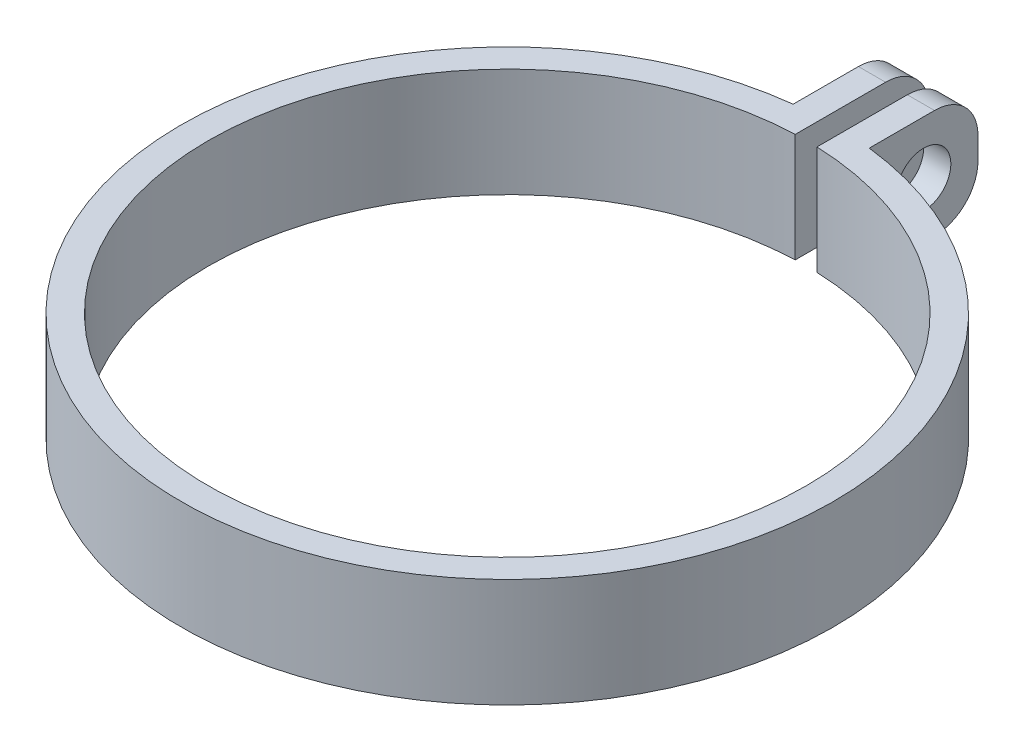
ISO-10303-21;
HEADER;
FILE_DESCRIPTION(('STEP AP214'),'2;1');
FILE_NAME('part.step','',(''),(''),'','','');
FILE_SCHEMA(('AUTOMOTIVE_DESIGN { 1 0 10303 214 1 1 1 1 }'));
ENDSEC;
DATA;
#1=APPLICATION_CONTEXT('core data for automotive mechanical design processes');
#2=APPLICATION_PROTOCOL_DEFINITION('international standard','automotive_design',2000,#1);
#3=PRODUCT_CONTEXT('',#1,'mechanical');
#4=PRODUCT('Part','Part','',(#3));
#5=PRODUCT_RELATED_PRODUCT_CATEGORY('part','',(#4));
#6=PRODUCT_DEFINITION_FORMATION('','',#4);
#7=PRODUCT_DEFINITION_CONTEXT('part definition',#1,'design');
#8=PRODUCT_DEFINITION('design','',#6,#7);
#9=PRODUCT_DEFINITION_SHAPE('','',#8);
#10=(LENGTH_UNIT() NAMED_UNIT(*) SI_UNIT(.MILLI.,.METRE.));
#11=(NAMED_UNIT(*) PLANE_ANGLE_UNIT() SI_UNIT($,.RADIAN.));
#12=(NAMED_UNIT(*) SI_UNIT($,.STERADIAN.) SOLID_ANGLE_UNIT());
#13=UNCERTAINTY_MEASURE_WITH_UNIT(LENGTH_MEASURE(1.E-05),#10,'distance_accuracy_value','');
#14=(GEOMETRIC_REPRESENTATION_CONTEXT(3) GLOBAL_UNCERTAINTY_ASSIGNED_CONTEXT((#13)) GLOBAL_UNIT_ASSIGNED_CONTEXT((#10,
#11,#12)) REPRESENTATION_CONTEXT('',''));
#15=CARTESIAN_POINT('',(0.,0.,0.));
#16=DIRECTION('',(0.,0.,1.));
#17=DIRECTION('',(1.,0.,0.));
#18=AXIS2_PLACEMENT_3D('',#15,#16,#17);
#19=CARTESIAN_POINT('',(0.,10.,0.));
#20=DIRECTION('',(0.,-1.,0.));
#21=DIRECTION('',(0.,0.,-1.));
#22=AXIS2_PLACEMENT_3D('',#19,#20,#21);
#23=CYLINDRICAL_SURFACE('',#22,27.5);
#24=CARTESIAN_POINT('',(0.,0.,0.));
#25=DIRECTION('',(0.,-1.,0.));
#26=DIRECTION('',(0.,0.,1.));
#27=AXIS2_PLACEMENT_3D('',#24,#25,#26);
#28=CIRCLE('',#27,27.5);
#29=CARTESIAN_POINT('',(1.,0.,-27.4818121673226));
#30=VERTEX_POINT('',#29);
#31=CARTESIAN_POINT('',(-0.999999999999999,0.,-27.4818121673226));
#32=VERTEX_POINT('',#31);
#33=EDGE_CURVE('E152',#30,#32,#28,.T.);
#34=ORIENTED_EDGE('',*,*,#33,.T.);
#35=DIRECTION('',(0.,-1.,0.));
#36=VECTOR('',#35,1.);
#37=CARTESIAN_POINT('',(-0.999999999999999,10.,-27.4818121673226));
#38=LINE('',#37,#36);
#39=CARTESIAN_POINT('',(-0.999999999999999,10.,-27.4818121673226));
#40=VERTEX_POINT('',#39);
#41=EDGE_CURVE('E131',#40,#32,#38,.T.);
#42=ORIENTED_EDGE('',*,*,#41,.F.);
#43=CARTESIAN_POINT('',(0.,10.,0.));
#44=DIRECTION('',(0.,-1.,0.));
#45=DIRECTION('',(0.,0.,1.));
#46=AXIS2_PLACEMENT_3D('',#43,#44,#45);
#47=CIRCLE('',#46,27.5);
#48=CARTESIAN_POINT('',(1.,10.,-27.4818121673226));
#49=VERTEX_POINT('',#48);
#50=EDGE_CURVE('E139',#49,#40,#47,.T.);
#51=ORIENTED_EDGE('',*,*,#50,.F.);
#52=DIRECTION('',(0.,-1.,0.));
#53=VECTOR('',#52,1.);
#54=CARTESIAN_POINT('',(1.,10.,-27.4818121673226));
#55=LINE('',#54,#53);
#56=EDGE_CURVE('E222',#49,#30,#55,.T.);
#57=ORIENTED_EDGE('',*,*,#56,.T.);
#58=EDGE_LOOP('',(#34,#42,#51,#57));
#59=FACE_BOUND('',#58,.T.);
#60=ADVANCED_FACE('F35',(#59),#23,.F.);
#61=CARTESIAN_POINT('',(-0.999999999999999,10.,-39.7951338308792));
#62=DIRECTION('',(-1.,0.,0.));
#63=DIRECTION('',(0.,0.,1.));
#64=AXIS2_PLACEMENT_3D('',#61,#62,#63);
#65=PLANE('',#64);
#66=CARTESIAN_POINT('',(-0.999999999999999,5.,-34.7951338308792));
#67=DIRECTION('',(-1.,0.,0.));
#68=DIRECTION('',(0.,0.,1.));
#69=AXIS2_PLACEMENT_3D('',#66,#67,#68);
#70=CIRCLE('',#69,2.5);
#71=CARTESIAN_POINT('',(-0.999999999999999,5.,-32.2951338308792));
#72=VERTEX_POINT('',#71);
#73=EDGE_CURVE('E231',#72,#72,#70,.T.);
#74=ORIENTED_EDGE('',*,*,#73,.T.);
#75=EDGE_LOOP('',(#74));
#76=FACE_BOUND('',#75,.T.);
#77=DIRECTION('',(0.,-1.,0.));
#78=VECTOR('',#77,1.);
#79=CARTESIAN_POINT('',(-0.999999999999999,10.,-39.7951338308792));
#80=LINE('',#79,#78);
#81=CARTESIAN_POINT('',(-0.999999999999999,6.,-39.7951338308792));
#82=VERTEX_POINT('',#81);
#83=CARTESIAN_POINT('',(-0.999999999999999,4.,-39.7951338308792));
#84=VERTEX_POINT('',#83);
#85=EDGE_CURVE('E154',#82,#84,#80,.T.);
#86=ORIENTED_EDGE('',*,*,#85,.F.);
#87=CARTESIAN_POINT('',(-0.999999999999999,6.,-35.7951338308792));
#88=DIRECTION('',(-1.,0.,0.));
#89=DIRECTION('',(0.,0.,1.));
#90=AXIS2_PLACEMENT_3D('',#87,#88,#89);
#91=CIRCLE('',#90,4.);
#92=CARTESIAN_POINT('',(-0.999999999999999,10.,-35.7951338308792));
#93=VERTEX_POINT('',#92);
#94=EDGE_CURVE('E134',#82,#93,#91,.F.);
#95=ORIENTED_EDGE('',*,*,#94,.T.);
#96=DIRECTION('',(0.,0.,-1.));
#97=VECTOR('',#96,1.);
#98=CARTESIAN_POINT('',(-0.999999999999999,10.,-39.7951338308792));
#99=LINE('',#98,#97);
#100=EDGE_CURVE('E125',#40,#93,#99,.T.);
#101=ORIENTED_EDGE('',*,*,#100,.F.);
#102=ORIENTED_EDGE('',*,*,#41,.T.);
#103=DIRECTION('',(0.,0.,-1.));
#104=VECTOR('',#103,1.);
#105=CARTESIAN_POINT('',(-0.999999999999999,0.,-39.7951338308792));
#106=LINE('',#105,#104);
#107=CARTESIAN_POINT('',(-0.999999999999999,0.,-35.7951338308792));
#108=VERTEX_POINT('',#107);
#109=EDGE_CURVE('E195',#32,#108,#106,.T.);
#110=ORIENTED_EDGE('',*,*,#109,.T.);
#111=CARTESIAN_POINT('',(-0.999999999999999,4.,-35.7951338308792));
#112=DIRECTION('',(-1.,0.,0.));
#113=DIRECTION('',(0.,0.,1.));
#114=AXIS2_PLACEMENT_3D('',#111,#112,#113);
#115=CIRCLE('',#114,4.);
#116=EDGE_CURVE('E178',#108,#84,#115,.F.);
#117=ORIENTED_EDGE('',*,*,#116,.T.);
#118=EDGE_LOOP('',(#86,#95,#101,#102,#110,#117));
#119=FACE_BOUND('',#118,.T.);
#120=ADVANCED_FACE('F128',(#76,#119),#65,.F.);
#121=CARTESIAN_POINT('',(-0.999999999999999,10.,-39.7951338308792));
#122=DIRECTION('',(0.,0.,1.));
#123=DIRECTION('',(1.,0.,0.));
#124=AXIS2_PLACEMENT_3D('',#121,#122,#123);
#125=PLANE('',#124);
#126=DIRECTION('',(0.,-1.,0.));
#127=VECTOR('',#126,1.);
#128=CARTESIAN_POINT('',(-3.5,10.,-39.7951338308792));
#129=LINE('',#128,#127);
#130=CARTESIAN_POINT('',(-3.5,6.,-39.7951338308792));
#131=VERTEX_POINT('',#130);
#132=CARTESIAN_POINT('',(-3.5,4.,-39.7951338308792));
#133=VERTEX_POINT('',#132);
#134=EDGE_CURVE('E159',#131,#133,#129,.T.);
#135=ORIENTED_EDGE('',*,*,#134,.F.);
#136=DIRECTION('',(-1.,0.,0.));
#137=VECTOR('',#136,1.);
#138=CARTESIAN_POINT('',(-0.999999999999999,6.,-39.7951338308792));
#139=LINE('',#138,#137);
#140=EDGE_CURVE('E176',#131,#82,#139,.F.);
#141=ORIENTED_EDGE('',*,*,#140,.T.);
#142=ORIENTED_EDGE('',*,*,#85,.T.);
#143=DIRECTION('',(-1.,0.,0.));
#144=VECTOR('',#143,1.);
#145=CARTESIAN_POINT('',(-0.999999999999999,4.,-39.7951338308792));
#146=LINE('',#145,#144);
#147=EDGE_CURVE('E173',#84,#133,#146,.T.);
#148=ORIENTED_EDGE('',*,*,#147,.T.);
#149=EDGE_LOOP('',(#135,#141,#142,#148));
#150=FACE_BOUND('',#149,.T.);
#151=ADVANCED_FACE('F205',(#150),#125,.F.);
#152=CARTESIAN_POINT('',(-3.5,10.,-39.7951338308792));
#153=DIRECTION('',(1.,0.,0.));
#154=DIRECTION('',(0.,0.,-1.));
#155=AXIS2_PLACEMENT_3D('',#152,#153,#154);
#156=PLANE('',#155);
#157=CARTESIAN_POINT('',(-3.5,5.,-34.7951338308792));
#158=DIRECTION('',(-1.,0.,0.));
#159=DIRECTION('',(0.,0.,1.));
#160=AXIS2_PLACEMENT_3D('',#157,#158,#159);
#161=CIRCLE('',#160,2.5);
#162=CARTESIAN_POINT('',(-3.5,5.,-32.2951338308792));
#163=VERTEX_POINT('',#162);
#164=EDGE_CURVE('E166',#163,#163,#161,.T.);
#165=ORIENTED_EDGE('',*,*,#164,.F.);
#166=EDGE_LOOP('',(#165));
#167=FACE_BOUND('',#166,.T.);
#168=DIRECTION('',(0.,0.,1.));
#169=VECTOR('',#168,1.);
#170=CARTESIAN_POINT('',(-3.5,10.,-39.7951338308792));
#171=LINE('',#170,#169);
#172=CARTESIAN_POINT('',(-3.5,10.,-35.7951338308792));
#173=VERTEX_POINT('',#172);
#174=CARTESIAN_POINT('',(-3.5,10.,-29.7951338308792));
#175=VERTEX_POINT('',#174);
#176=EDGE_CURVE('E138',#173,#175,#171,.T.);
#177=ORIENTED_EDGE('',*,*,#176,.F.);
#178=CARTESIAN_POINT('',(-3.5,6.,-35.7951338308792));
#179=DIRECTION('',(1.,0.,0.));
#180=DIRECTION('',(0.,0.,-1.));
#181=AXIS2_PLACEMENT_3D('',#178,#179,#180);
#182=CIRCLE('',#181,4.);
#183=EDGE_CURVE('E171',#173,#131,#182,.F.);
#184=ORIENTED_EDGE('',*,*,#183,.T.);
#185=ORIENTED_EDGE('',*,*,#134,.T.);
#186=CARTESIAN_POINT('',(-3.5,4.,-35.7951338308792));
#187=DIRECTION('',(1.,0.,0.));
#188=DIRECTION('',(0.,0.,-1.));
#189=AXIS2_PLACEMENT_3D('',#186,#187,#188);
#190=CIRCLE('',#189,4.);
#191=CARTESIAN_POINT('',(-3.5,0.,-35.7951338308792));
#192=VERTEX_POINT('',#191);
#193=EDGE_CURVE('E169',#133,#192,#190,.F.);
#194=ORIENTED_EDGE('',*,*,#193,.T.);
#195=DIRECTION('',(0.,0.,1.));
#196=VECTOR('',#195,1.);
#197=CARTESIAN_POINT('',(-3.5,0.,-39.7951338308792));
#198=LINE('',#197,#196);
#199=CARTESIAN_POINT('',(-3.5,0.,-29.7951338308792));
#200=VERTEX_POINT('',#199);
#201=EDGE_CURVE('E197',#192,#200,#198,.T.);
#202=ORIENTED_EDGE('',*,*,#201,.T.);
#203=DIRECTION('',(0.,-1.,0.));
#204=VECTOR('',#203,1.);
#205=CARTESIAN_POINT('',(-3.5,10.,-29.7951338308792));
#206=LINE('',#205,#204);
#207=EDGE_CURVE('E210',#175,#200,#206,.T.);
#208=ORIENTED_EDGE('',*,*,#207,.F.);
#209=EDGE_LOOP('',(#177,#184,#185,#194,#202,#208));
#210=FACE_BOUND('',#209,.T.);
#211=ADVANCED_FACE('F209',(#167,#210),#156,.F.);
#212=CARTESIAN_POINT('',(0.,10.,0.));
#213=DIRECTION('',(0.,-1.,0.));
#214=DIRECTION('',(0.,0.,-1.));
#215=AXIS2_PLACEMENT_3D('',#212,#213,#214);
#216=CYLINDRICAL_SURFACE('',#215,30.);
#217=CARTESIAN_POINT('',(0.,0.,0.));
#218=DIRECTION('',(0.,1.,0.));
#219=DIRECTION('',(0.,0.,1.));
#220=AXIS2_PLACEMENT_3D('',#217,#218,#219);
#221=CIRCLE('',#220,30.);
#222=CARTESIAN_POINT('',(3.5,0.,-29.7951338308792));
#223=VERTEX_POINT('',#222);
#224=EDGE_CURVE('E227',#200,#223,#221,.T.);
#225=ORIENTED_EDGE('',*,*,#224,.T.);
#226=DIRECTION('',(0.,-1.,0.));
#227=VECTOR('',#226,1.);
#228=CARTESIAN_POINT('',(3.5,10.,-29.7951338308792));
#229=LINE('',#228,#227);
#230=CARTESIAN_POINT('',(3.5,10.,-29.7951338308792));
#231=VERTEX_POINT('',#230);
#232=EDGE_CURVE('E212',#231,#223,#229,.T.);
#233=ORIENTED_EDGE('',*,*,#232,.F.);
#234=CARTESIAN_POINT('',(0.,10.,0.));
#235=DIRECTION('',(0.,1.,0.));
#236=DIRECTION('',(0.,0.,1.));
#237=AXIS2_PLACEMENT_3D('',#234,#235,#236);
#238=CIRCLE('',#237,30.);
#239=EDGE_CURVE('E236',#175,#231,#238,.T.);
#240=ORIENTED_EDGE('',*,*,#239,.F.);
#241=ORIENTED_EDGE('',*,*,#207,.T.);
#242=EDGE_LOOP('',(#225,#233,#240,#241));
#243=FACE_BOUND('',#242,.T.);
#244=ADVANCED_FACE('F250',(#243),#216,.T.);
#245=CARTESIAN_POINT('',(3.5,10.,-39.7951338308792));
#246=DIRECTION('',(-1.,0.,0.));
#247=DIRECTION('',(0.,0.,1.));
#248=AXIS2_PLACEMENT_3D('',#245,#246,#247);
#249=PLANE('',#248);
#250=CARTESIAN_POINT('',(3.5,5.,-34.7951338308792));
#251=DIRECTION('',(-1.,0.,0.));
#252=DIRECTION('',(0.,0.,1.));
#253=AXIS2_PLACEMENT_3D('',#250,#251,#252);
#254=CIRCLE('',#253,2.5);
#255=CARTESIAN_POINT('',(3.5,5.,-32.2951338308792));
#256=VERTEX_POINT('',#255);
#257=EDGE_CURVE('E165',#256,#256,#254,.T.);
#258=ORIENTED_EDGE('',*,*,#257,.T.);
#259=EDGE_LOOP('',(#258));
#260=FACE_BOUND('',#259,.T.);
#261=DIRECTION('',(0.,-1.,0.));
#262=VECTOR('',#261,1.);
#263=CARTESIAN_POINT('',(3.5,10.,-39.7951338308792));
#264=LINE('',#263,#262);
#265=CARTESIAN_POINT('',(3.5,6.,-39.7951338308792));
#266=VERTEX_POINT('',#265);
#267=CARTESIAN_POINT('',(3.5,4.,-39.7951338308792));
#268=VERTEX_POINT('',#267);
#269=EDGE_CURVE('E217',#266,#268,#264,.T.);
#270=ORIENTED_EDGE('',*,*,#269,.F.);
#271=CARTESIAN_POINT('',(3.5,6.,-35.7951338308792));
#272=DIRECTION('',(-1.,0.,0.));
#273=DIRECTION('',(0.,0.,1.));
#274=AXIS2_PLACEMENT_3D('',#271,#272,#273);
#275=CIRCLE('',#274,4.);
#276=CARTESIAN_POINT('',(3.5,10.,-35.7951338308792));
#277=VERTEX_POINT('',#276);
#278=EDGE_CURVE('E191',#266,#277,#275,.F.);
#279=ORIENTED_EDGE('',*,*,#278,.T.);
#280=DIRECTION('',(0.,0.,-1.));
#281=VECTOR('',#280,1.);
#282=CARTESIAN_POINT('',(3.5,10.,-39.7951338308792));
#283=LINE('',#282,#281);
#284=EDGE_CURVE('E233',#231,#277,#283,.T.);
#285=ORIENTED_EDGE('',*,*,#284,.F.);
#286=ORIENTED_EDGE('',*,*,#232,.T.);
#287=DIRECTION('',(0.,0.,-1.));
#288=VECTOR('',#287,1.);
#289=CARTESIAN_POINT('',(3.5,0.,-39.7951338308792));
#290=LINE('',#289,#288);
#291=CARTESIAN_POINT('',(3.5,0.,-35.7951338308792));
#292=VERTEX_POINT('',#291);
#293=EDGE_CURVE('E225',#223,#292,#290,.T.);
#294=ORIENTED_EDGE('',*,*,#293,.T.);
#295=CARTESIAN_POINT('',(3.5,4.,-35.7951338308792));
#296=DIRECTION('',(-1.,0.,0.));
#297=DIRECTION('',(0.,0.,1.));
#298=AXIS2_PLACEMENT_3D('',#295,#296,#297);
#299=CIRCLE('',#298,4.);
#300=EDGE_CURVE('E55',#292,#268,#299,.F.);
#301=ORIENTED_EDGE('',*,*,#300,.T.);
#302=EDGE_LOOP('',(#270,#279,#285,#286,#294,#301));
#303=FACE_BOUND('',#302,.T.);
#304=ADVANCED_FACE('F256',(#260,#303),#249,.F.);
#305=CARTESIAN_POINT('',(1.,10.,-39.7951338308792));
#306=DIRECTION('',(0.,0.,1.));
#307=DIRECTION('',(1.,0.,0.));
#308=AXIS2_PLACEMENT_3D('',#305,#306,#307);
#309=PLANE('',#308);
#310=DIRECTION('',(0.,-1.,0.));
#311=VECTOR('',#310,1.);
#312=CARTESIAN_POINT('',(1.,10.,-39.7951338308792));
#313=LINE('',#312,#311);
#314=CARTESIAN_POINT('',(1.,6.,-39.7951338308792));
#315=VERTEX_POINT('',#314);
#316=CARTESIAN_POINT('',(1.,4.,-39.7951338308792));
#317=VERTEX_POINT('',#316);
#318=EDGE_CURVE('E219',#315,#317,#313,.T.);
#319=ORIENTED_EDGE('',*,*,#318,.F.);
#320=DIRECTION('',(-1.,0.,0.));
#321=VECTOR('',#320,1.);
#322=CARTESIAN_POINT('',(3.5,6.,-39.7951338308792));
#323=LINE('',#322,#321);
#324=EDGE_CURVE('E188',#315,#266,#323,.F.);
#325=ORIENTED_EDGE('',*,*,#324,.T.);
#326=ORIENTED_EDGE('',*,*,#269,.T.);
#327=DIRECTION('',(-1.,0.,0.));
#328=VECTOR('',#327,1.);
#329=CARTESIAN_POINT('',(1.,4.,-39.7951338308792));
#330=LINE('',#329,#328);
#331=EDGE_CURVE('E185',#268,#317,#330,.T.);
#332=ORIENTED_EDGE('',*,*,#331,.T.);
#333=EDGE_LOOP('',(#319,#325,#326,#332));
#334=FACE_BOUND('',#333,.T.);
#335=ADVANCED_FACE('F284',(#334),#309,.F.);
#336=CARTESIAN_POINT('',(1.,10.,-27.4818121673226));
#337=DIRECTION('',(1.,0.,0.));
#338=DIRECTION('',(0.,0.,-1.));
#339=AXIS2_PLACEMENT_3D('',#336,#337,#338);
#340=PLANE('',#339);
#341=CARTESIAN_POINT('',(1.,5.,-34.7951338308792));
#342=DIRECTION('',(1.,0.,0.));
#343=DIRECTION('',(0.,0.,-1.));
#344=AXIS2_PLACEMENT_3D('',#341,#342,#343);
#345=CIRCLE('',#344,2.5);
#346=CARTESIAN_POINT('',(1.,5.,-37.2951338308792));
#347=VERTEX_POINT('',#346);
#348=EDGE_CURVE('E163',#347,#347,#345,.T.);
#349=ORIENTED_EDGE('',*,*,#348,.T.);
#350=EDGE_LOOP('',(#349));
#351=FACE_BOUND('',#350,.T.);
#352=DIRECTION('',(0.,0.,1.));
#353=VECTOR('',#352,1.);
#354=CARTESIAN_POINT('',(1.,10.,-27.4818121673226));
#355=LINE('',#354,#353);
#356=CARTESIAN_POINT('',(1.,10.,-35.7951338308792));
#357=VERTEX_POINT('',#356);
#358=EDGE_CURVE('E145',#357,#49,#355,.T.);
#359=ORIENTED_EDGE('',*,*,#358,.F.);
#360=CARTESIAN_POINT('',(1.,6.,-35.7951338308792));
#361=DIRECTION('',(1.,0.,0.));
#362=DIRECTION('',(0.,0.,-1.));
#363=AXIS2_PLACEMENT_3D('',#360,#361,#362);
#364=CIRCLE('',#363,4.);
#365=EDGE_CURVE('E183',#357,#315,#364,.F.);
#366=ORIENTED_EDGE('',*,*,#365,.T.);
#367=ORIENTED_EDGE('',*,*,#318,.T.);
#368=CARTESIAN_POINT('',(1.,4.,-35.7951338308792));
#369=DIRECTION('',(1.,0.,0.));
#370=DIRECTION('',(0.,0.,-1.));
#371=AXIS2_PLACEMENT_3D('',#368,#369,#370);
#372=CIRCLE('',#371,4.);
#373=CARTESIAN_POINT('',(1.,0.,-35.7951338308792));
#374=VERTEX_POINT('',#373);
#375=EDGE_CURVE('E181',#317,#374,#372,.F.);
#376=ORIENTED_EDGE('',*,*,#375,.T.);
#377=DIRECTION('',(0.,0.,1.));
#378=VECTOR('',#377,1.);
#379=CARTESIAN_POINT('',(1.,0.,-27.4818121673226));
#380=LINE('',#379,#378);
#381=EDGE_CURVE('E149',#374,#30,#380,.T.);
#382=ORIENTED_EDGE('',*,*,#381,.T.);
#383=ORIENTED_EDGE('',*,*,#56,.F.);
#384=EDGE_LOOP('',(#359,#366,#367,#376,#382,#383));
#385=FACE_BOUND('',#384,.T.);
#386=ADVANCED_FACE('F287',(#351,#385),#340,.F.);
#387=CARTESIAN_POINT('',(0.,10.,0.));
#388=DIRECTION('',(0.,1.,0.));
#389=DIRECTION('',(0.,0.,1.));
#390=AXIS2_PLACEMENT_3D('',#387,#388,#389);
#391=PLANE('',#390);
#392=ORIENTED_EDGE('',*,*,#100,.T.);
#393=DIRECTION('',(-1.,0.,0.));
#394=VECTOR('',#393,1.);
#395=CARTESIAN_POINT('',(-3.5,10.,-35.7951338308792));
#396=LINE('',#395,#394);
#397=EDGE_CURVE('E156',#93,#173,#396,.T.);
#398=ORIENTED_EDGE('',*,*,#397,.T.);
#399=ORIENTED_EDGE('',*,*,#176,.T.);
#400=ORIENTED_EDGE('',*,*,#239,.T.);
#401=ORIENTED_EDGE('',*,*,#284,.T.);
#402=DIRECTION('',(-1.,0.,0.));
#403=VECTOR('',#402,1.);
#404=CARTESIAN_POINT('',(1.,10.,-35.7951338308792));
#405=LINE('',#404,#403);
#406=EDGE_CURVE('E153',#277,#357,#405,.T.);
#407=ORIENTED_EDGE('',*,*,#406,.T.);
#408=ORIENTED_EDGE('',*,*,#358,.T.);
#409=ORIENTED_EDGE('',*,*,#50,.T.);
#410=EDGE_LOOP('',(#392,#398,#399,#400,#401,#407,#408,#409));
#411=FACE_BOUND('',#410,.T.);
#412=ADVANCED_FACE('F142',(#411),#391,.T.);
#413=CARTESIAN_POINT('',(0.,0.,0.));
#414=DIRECTION('',(0.,1.,0.));
#415=DIRECTION('',(0.,0.,1.));
#416=AXIS2_PLACEMENT_3D('',#413,#414,#415);
#417=PLANE('',#416);
#418=ORIENTED_EDGE('',*,*,#381,.F.);
#419=DIRECTION('',(-1.,0.,0.));
#420=VECTOR('',#419,1.);
#421=CARTESIAN_POINT('',(0.,0.,-35.7951338308792));
#422=LINE('',#421,#420);
#423=EDGE_CURVE('E11',#374,#292,#422,.F.);
#424=ORIENTED_EDGE('',*,*,#423,.T.);
#425=ORIENTED_EDGE('',*,*,#293,.F.);
#426=ORIENTED_EDGE('',*,*,#224,.F.);
#427=ORIENTED_EDGE('',*,*,#201,.F.);
#428=DIRECTION('',(-1.,0.,0.));
#429=VECTOR('',#428,1.);
#430=CARTESIAN_POINT('',(0.,0.,-35.7951338308792));
#431=LINE('',#430,#429);
#432=EDGE_CURVE('E43',#192,#108,#431,.F.);
#433=ORIENTED_EDGE('',*,*,#432,.T.);
#434=ORIENTED_EDGE('',*,*,#109,.F.);
#435=ORIENTED_EDGE('',*,*,#33,.F.);
#436=EDGE_LOOP('',(#418,#424,#425,#426,#427,#433,#434,#435));
#437=FACE_BOUND('',#436,.T.);
#438=ADVANCED_FACE('F194',(#437),#417,.F.);
#439=CARTESIAN_POINT('',(6.5,5.,-34.7951338308792));
#440=DIRECTION('',(-1.,0.,0.));
#441=DIRECTION('',(0.,0.,1.));
#442=AXIS2_PLACEMENT_3D('',#439,#440,#441);
#443=CYLINDRICAL_SURFACE('',#442,2.5);
#444=ORIENTED_EDGE('',*,*,#348,.F.);
#445=EDGE_LOOP('',(#444));
#446=FACE_BOUND('',#445,.T.);
#447=ORIENTED_EDGE('',*,*,#257,.F.);
#448=EDGE_LOOP('',(#447));
#449=FACE_BOUND('',#448,.T.);
#450=ADVANCED_FACE('F307',(#446,#449),#443,.F.);
#451=ORIENTED_EDGE('',*,*,#164,.T.);
#452=EDGE_LOOP('',(#451));
#453=FACE_BOUND('',#452,.T.);
#454=ORIENTED_EDGE('',*,*,#73,.F.);
#455=EDGE_LOOP('',(#454));
#456=FACE_BOUND('',#455,.T.);
#457=ADVANCED_FACE('F246',(#453,#456),#443,.F.);
#458=CARTESIAN_POINT('',(0.,6.,-35.7951338308792));
#459=DIRECTION('',(1.,0.,0.));
#460=DIRECTION('',(0.,0.,-1.));
#461=AXIS2_PLACEMENT_3D('',#458,#459,#460);
#462=CYLINDRICAL_SURFACE('',#461,4.);
#463=ORIENTED_EDGE('',*,*,#94,.F.);
#464=ORIENTED_EDGE('',*,*,#140,.F.);
#465=ORIENTED_EDGE('',*,*,#183,.F.);
#466=ORIENTED_EDGE('',*,*,#397,.F.);
#467=EDGE_LOOP('',(#463,#464,#465,#466));
#468=FACE_BOUND('',#467,.T.);
#469=ADVANCED_FACE('F268',(#468),#462,.T.);
#470=CARTESIAN_POINT('',(0.,6.,-35.7951338308792));
#471=DIRECTION('',(1.,0.,0.));
#472=DIRECTION('',(0.,0.,-1.));
#473=AXIS2_PLACEMENT_3D('',#470,#471,#472);
#474=CYLINDRICAL_SURFACE('',#473,4.);
#475=ORIENTED_EDGE('',*,*,#278,.F.);
#476=ORIENTED_EDGE('',*,*,#324,.F.);
#477=ORIENTED_EDGE('',*,*,#365,.F.);
#478=ORIENTED_EDGE('',*,*,#406,.F.);
#479=EDGE_LOOP('',(#475,#476,#477,#478));
#480=FACE_BOUND('',#479,.T.);
#481=ADVANCED_FACE('F271',(#480),#474,.T.);
#482=CARTESIAN_POINT('',(1.,4.,-35.7951338308792));
#483=DIRECTION('',(-1.,0.,0.));
#484=DIRECTION('',(0.,0.,1.));
#485=AXIS2_PLACEMENT_3D('',#482,#483,#484);
#486=CYLINDRICAL_SURFACE('',#485,4.);
#487=ORIENTED_EDGE('',*,*,#300,.F.);
#488=ORIENTED_EDGE('',*,*,#423,.F.);
#489=ORIENTED_EDGE('',*,*,#375,.F.);
#490=ORIENTED_EDGE('',*,*,#331,.F.);
#491=EDGE_LOOP('',(#487,#488,#489,#490));
#492=FACE_BOUND('',#491,.T.);
#493=ADVANCED_FACE('F274',(#492),#486,.T.);
#494=CARTESIAN_POINT('',(-0.999999999999999,4.,-35.7951338308792));
#495=DIRECTION('',(-1.,0.,0.));
#496=DIRECTION('',(0.,0.,1.));
#497=AXIS2_PLACEMENT_3D('',#494,#495,#496);
#498=CYLINDRICAL_SURFACE('',#497,4.);
#499=ORIENTED_EDGE('',*,*,#116,.F.);
#500=ORIENTED_EDGE('',*,*,#432,.F.);
#501=ORIENTED_EDGE('',*,*,#193,.F.);
#502=ORIENTED_EDGE('',*,*,#147,.F.);
#503=EDGE_LOOP('',(#499,#500,#501,#502));
#504=FACE_BOUND('',#503,.T.);
#505=ADVANCED_FACE('F37',(#504),#498,.T.);
#506=CLOSED_SHELL('',(#60,#120,#151,#211,#244,#304,#335,#386,#412,#438,#450,#457,#469,#481,#493,#505));
#507=MANIFOLD_SOLID_BREP('B2',#506);
#508=ADVANCED_BREP_SHAPE_REPRESENTATION('',(#18,#507),#14);
#509=SHAPE_DEFINITION_REPRESENTATION(#9,#508);
ENDSEC;
END-ISO-10303-21;
